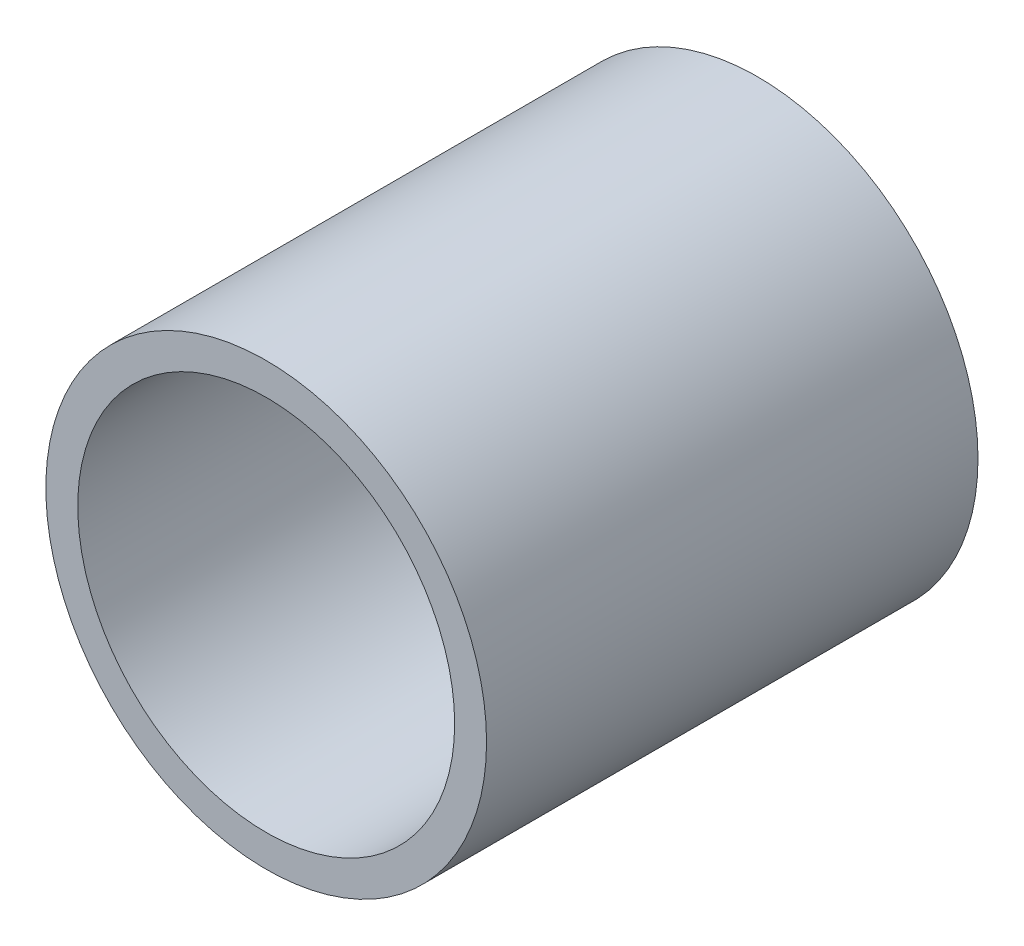
ISO-10303-21;
HEADER;
FILE_DESCRIPTION(('STEP AP214'),'2;1');
FILE_NAME('part.step','',(''),(''),'','','');
FILE_SCHEMA(('AUTOMOTIVE_DESIGN { 1 0 10303 214 1 1 1 1 }'));
ENDSEC;
DATA;
#1=APPLICATION_CONTEXT('core data for automotive mechanical design processes');
#2=APPLICATION_PROTOCOL_DEFINITION('international standard','automotive_design',2000,#1);
#3=PRODUCT_CONTEXT('',#1,'mechanical');
#4=PRODUCT('Part','Part','',(#3));
#5=PRODUCT_RELATED_PRODUCT_CATEGORY('part','',(#4));
#6=PRODUCT_DEFINITION_FORMATION('','',#4);
#7=PRODUCT_DEFINITION_CONTEXT('part definition',#1,'design');
#8=PRODUCT_DEFINITION('design','',#6,#7);
#9=PRODUCT_DEFINITION_SHAPE('','',#8);
#10=(LENGTH_UNIT() NAMED_UNIT(*) SI_UNIT(.MILLI.,.METRE.));
#11=(NAMED_UNIT(*) PLANE_ANGLE_UNIT() SI_UNIT($,.RADIAN.));
#12=(NAMED_UNIT(*) SI_UNIT($,.STERADIAN.) SOLID_ANGLE_UNIT());
#13=UNCERTAINTY_MEASURE_WITH_UNIT(LENGTH_MEASURE(1.E-05),#10,'distance_accuracy_value','');
#14=(GEOMETRIC_REPRESENTATION_CONTEXT(3) GLOBAL_UNCERTAINTY_ASSIGNED_CONTEXT((#13)) GLOBAL_UNIT_ASSIGNED_CONTEXT((#10,
#11,#12)) REPRESENTATION_CONTEXT('',''));
#15=CARTESIAN_POINT('',(0.,0.,0.));
#16=DIRECTION('',(0.,0.,1.));
#17=DIRECTION('',(1.,0.,0.));
#18=AXIS2_PLACEMENT_3D('',#15,#16,#17);
#19=CARTESIAN_POINT('',(0.,0.,0.));
#20=DIRECTION('',(0.,0.,-1.));
#21=DIRECTION('',(1.,0.,0.));
#22=AXIS2_PLACEMENT_3D('',#19,#20,#21);
#23=CYLINDRICAL_SURFACE('',#22,0.1753997);
#24=CARTESIAN_POINT('',(0.,0.,0.39116));
#25=DIRECTION('',(0.,0.,1.));
#26=DIRECTION('',(1.,0.,0.));
#27=AXIS2_PLACEMENT_3D('',#24,#25,#26);
#28=CIRCLE('',#27,0.1753997);
#29=CARTESIAN_POINT('',(0.1753997,0.,0.39116));
#30=VERTEX_POINT('',#29);
#31=EDGE_CURVE('E11',#30,#30,#28,.T.);
#32=ORIENTED_EDGE('',*,*,#31,.F.);
#33=DIRECTION('',(0.,0.,1.));
#34=VECTOR('',#33,1.);
#35=CARTESIAN_POINT('',(0.1753997,0.,0.));
#36=LINE('',#35,#34);
#37=CARTESIAN_POINT('',(0.1753997,0.,0.));
#38=VERTEX_POINT('',#37);
#39=EDGE_CURVE('E23',#38,#30,#36,.T.);
#40=ORIENTED_EDGE('',*,*,#39,.F.);
#41=CARTESIAN_POINT('',(0.,0.,0.));
#42=DIRECTION('',(0.,0.,1.));
#43=DIRECTION('',(1.,0.,0.));
#44=AXIS2_PLACEMENT_3D('',#41,#42,#43);
#45=CIRCLE('',#44,0.1753997);
#46=EDGE_CURVE('E45',#38,#38,#45,.T.);
#47=ORIENTED_EDGE('',*,*,#46,.T.);
#48=ORIENTED_EDGE('',*,*,#39,.T.);
#49=EDGE_LOOP('',(#32,#40,#47,#48));
#50=FACE_BOUND('',#49,.T.);
#51=ADVANCED_FACE('F16',(#50),#23,.T.);
#52=CARTESIAN_POINT('',(0.,0.,0.));
#53=DIRECTION('',(0.,0.,-1.));
#54=DIRECTION('',(1.,0.,0.));
#55=AXIS2_PLACEMENT_3D('',#52,#53,#54);
#56=CYLINDRICAL_SURFACE('',#55,0.1499997);
#57=DIRECTION('',(0.,0.,1.));
#58=VECTOR('',#57,1.);
#59=CARTESIAN_POINT('',(0.1499997,0.,0.));
#60=LINE('',#59,#58);
#61=CARTESIAN_POINT('',(0.1499997,0.,0.));
#62=VERTEX_POINT('',#61);
#63=CARTESIAN_POINT('',(0.1499997,0.,0.39116));
#64=VERTEX_POINT('',#63);
#65=EDGE_CURVE('E39',#62,#64,#60,.T.);
#66=ORIENTED_EDGE('',*,*,#65,.T.);
#67=CARTESIAN_POINT('',(0.,0.,0.39116));
#68=DIRECTION('',(0.,0.,1.));
#69=DIRECTION('',(1.,0.,0.));
#70=AXIS2_PLACEMENT_3D('',#67,#68,#69);
#71=CIRCLE('',#70,0.1499997);
#72=EDGE_CURVE('E44',#64,#64,#71,.T.);
#73=ORIENTED_EDGE('',*,*,#72,.T.);
#74=ORIENTED_EDGE('',*,*,#65,.F.);
#75=CARTESIAN_POINT('',(0.,0.,0.));
#76=DIRECTION('',(0.,0.,1.));
#77=DIRECTION('',(1.,0.,0.));
#78=AXIS2_PLACEMENT_3D('',#75,#76,#77);
#79=CIRCLE('',#78,0.1499997);
#80=EDGE_CURVE('E42',#62,#62,#79,.T.);
#81=ORIENTED_EDGE('',*,*,#80,.F.);
#82=EDGE_LOOP('',(#66,#73,#74,#81));
#83=FACE_BOUND('',#82,.T.);
#84=ADVANCED_FACE('F41',(#83),#56,.F.);
#85=CARTESIAN_POINT('',(0.,0.,0.));
#86=DIRECTION('',(0.,0.,1.));
#87=DIRECTION('',(1.,0.,0.));
#88=AXIS2_PLACEMENT_3D('',#85,#86,#87);
#89=PLANE('',#88);
#90=ORIENTED_EDGE('',*,*,#46,.F.);
#91=EDGE_LOOP('',(#90));
#92=FACE_BOUND('',#91,.T.);
#93=ORIENTED_EDGE('',*,*,#80,.T.);
#94=EDGE_LOOP('',(#93));
#95=FACE_BOUND('',#94,.T.);
#96=ADVANCED_FACE('F48',(#92,#95),#89,.F.);
#97=CARTESIAN_POINT('',(0.,0.,0.39116));
#98=DIRECTION('',(0.,0.,1.));
#99=DIRECTION('',(1.,0.,0.));
#100=AXIS2_PLACEMENT_3D('',#97,#98,#99);
#101=PLANE('',#100);
#102=ORIENTED_EDGE('',*,*,#31,.T.);
#103=EDGE_LOOP('',(#102));
#104=FACE_BOUND('',#103,.T.);
#105=ORIENTED_EDGE('',*,*,#72,.F.);
#106=EDGE_LOOP('',(#105));
#107=FACE_BOUND('',#106,.T.);
#108=ADVANCED_FACE('F55',(#104,#107),#101,.T.);
#109=CLOSED_SHELL('',(#51,#84,#96,#108));
#110=MANIFOLD_SOLID_BREP('B1',#109);
#111=ADVANCED_BREP_SHAPE_REPRESENTATION('',(#18,#110),#14);
#112=SHAPE_DEFINITION_REPRESENTATION(#9,#111);
ENDSEC;
END-ISO-10303-21;
